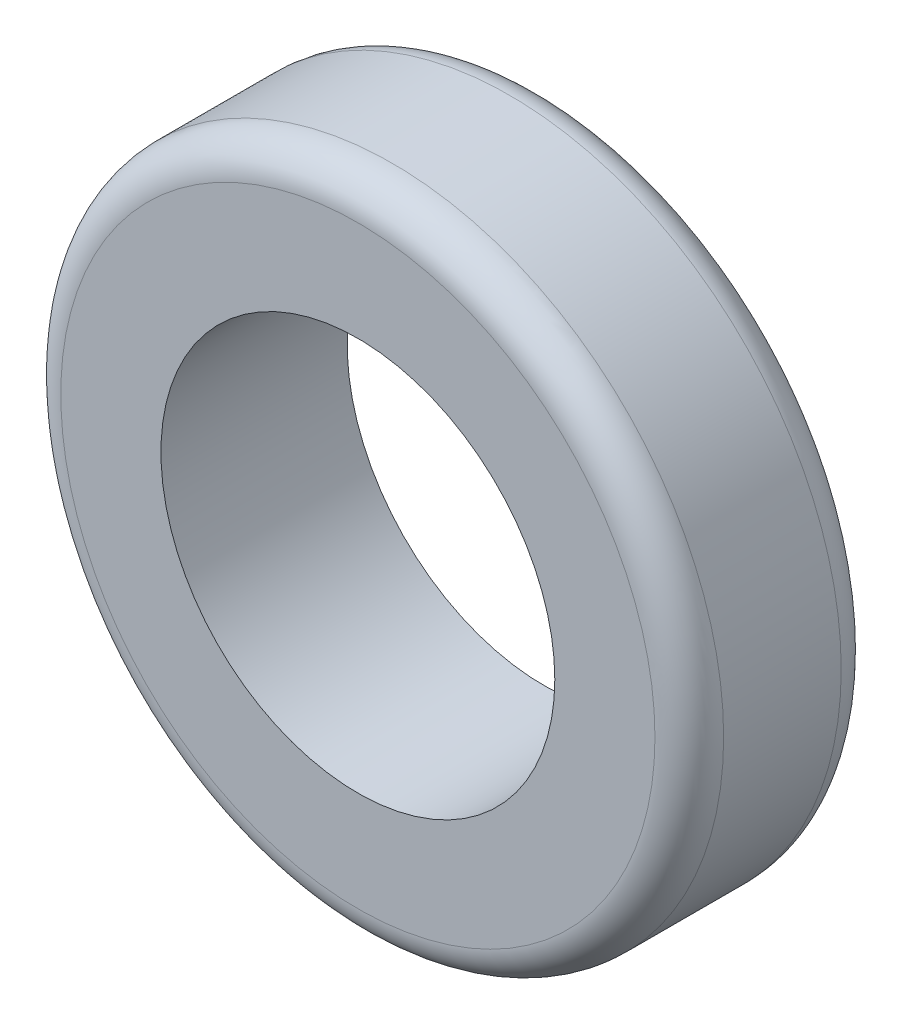
ISO-10303-21;
HEADER;
FILE_DESCRIPTION(('STEP AP214'),'2;1');
FILE_NAME('part.step','',(''),(''),'','','');
FILE_SCHEMA(('AUTOMOTIVE_DESIGN { 1 0 10303 214 1 1 1 1 }'));
ENDSEC;
DATA;
#1=APPLICATION_CONTEXT('core data for automotive mechanical design processes');
#2=APPLICATION_PROTOCOL_DEFINITION('international standard','automotive_design',2000,#1);
#3=PRODUCT_CONTEXT('',#1,'mechanical');
#4=PRODUCT('Part','Part','',(#3));
#5=PRODUCT_RELATED_PRODUCT_CATEGORY('part','',(#4));
#6=PRODUCT_DEFINITION_FORMATION('','',#4);
#7=PRODUCT_DEFINITION_CONTEXT('part definition',#1,'design');
#8=PRODUCT_DEFINITION('design','',#6,#7);
#9=PRODUCT_DEFINITION_SHAPE('','',#8);
#10=(LENGTH_UNIT() NAMED_UNIT(*) SI_UNIT(.MILLI.,.METRE.));
#11=(NAMED_UNIT(*) PLANE_ANGLE_UNIT() SI_UNIT($,.RADIAN.));
#12=(NAMED_UNIT(*) SI_UNIT($,.STERADIAN.) SOLID_ANGLE_UNIT());
#13=UNCERTAINTY_MEASURE_WITH_UNIT(LENGTH_MEASURE(1.E-05),#10,'distance_accuracy_value','');
#14=(GEOMETRIC_REPRESENTATION_CONTEXT(3) GLOBAL_UNCERTAINTY_ASSIGNED_CONTEXT((#13)) GLOBAL_UNIT_ASSIGNED_CONTEXT((#10,
#11,#12)) REPRESENTATION_CONTEXT('',''));
#15=CARTESIAN_POINT('',(0.,0.,0.));
#16=DIRECTION('',(0.,0.,1.));
#17=DIRECTION('',(1.,0.,0.));
#18=AXIS2_PLACEMENT_3D('',#15,#16,#17);
#19=CARTESIAN_POINT('',(58.7426052187726,48.9426246368741,54.23));
#20=DIRECTION('',(0.,0.,-1.));
#21=DIRECTION('',(-1.,0.,0.));
#22=AXIS2_PLACEMENT_3D('',#19,#20,#21);
#23=CYLINDRICAL_SURFACE('',#22,96.5);
#24=CARTESIAN_POINT('',(58.7426052187726,48.9426246368741,10.));
#25=DIRECTION('',(0.,0.,1.));
#26=DIRECTION('',(1.,0.,0.));
#27=AXIS2_PLACEMENT_3D('',#24,#25,#26);
#28=CIRCLE('',#27,96.5);
#29=CARTESIAN_POINT('',(155.242605218773,48.9426246368741,10.));
#30=VERTEX_POINT('',#29);
#31=EDGE_CURVE('E43',#30,#30,#28,.T.);
#32=ORIENTED_EDGE('',*,*,#31,.T.);
#33=EDGE_LOOP('',(#32));
#34=FACE_BOUND('',#33,.T.);
#35=CARTESIAN_POINT('',(58.7426052187726,48.9426246368741,44.23));
#36=DIRECTION('',(0.,0.,1.));
#37=DIRECTION('',(1.,0.,0.));
#38=AXIS2_PLACEMENT_3D('',#35,#36,#37);
#39=CIRCLE('',#38,96.5);
#40=CARTESIAN_POINT('',(155.242605218773,48.9426246368741,44.23));
#41=VERTEX_POINT('',#40);
#42=EDGE_CURVE('E47',#41,#41,#39,.F.);
#43=ORIENTED_EDGE('',*,*,#42,.T.);
#44=EDGE_LOOP('',(#43));
#45=FACE_BOUND('',#44,.T.);
#46=ADVANCED_FACE('F32',(#34,#45),#23,.T.);
#47=CARTESIAN_POINT('',(58.7426052187726,48.9426246368741,54.23));
#48=DIRECTION('',(0.,0.,1.));
#49=DIRECTION('',(1.,0.,0.));
#50=AXIS2_PLACEMENT_3D('',#47,#48,#49);
#51=PLANE('',#50);
#52=CARTESIAN_POINT('',(58.7426052187726,48.9426246368741,54.23));
#53=DIRECTION('',(0.,0.,1.));
#54=DIRECTION('',(1.,0.,0.));
#55=AXIS2_PLACEMENT_3D('',#52,#53,#54);
#56=CIRCLE('',#55,57.34);
#57=CARTESIAN_POINT('',(116.082605218773,48.9426246368741,54.23));
#58=VERTEX_POINT('',#57);
#59=EDGE_CURVE('E53',#58,#58,#56,.T.);
#60=ORIENTED_EDGE('',*,*,#59,.F.);
#61=EDGE_LOOP('',(#60));
#62=FACE_BOUND('',#61,.T.);
#63=CARTESIAN_POINT('',(58.7426052187726,48.9426246368741,54.23));
#64=DIRECTION('',(0.,0.,1.));
#65=DIRECTION('',(1.,0.,0.));
#66=AXIS2_PLACEMENT_3D('',#63,#64,#65);
#67=CIRCLE('',#66,86.5);
#68=CARTESIAN_POINT('',(145.242605218773,48.9426246368741,54.23));
#69=VERTEX_POINT('',#68);
#70=EDGE_CURVE('E10',#69,#69,#67,.T.);
#71=ORIENTED_EDGE('',*,*,#70,.T.);
#72=EDGE_LOOP('',(#71));
#73=FACE_BOUND('',#72,.T.);
#74=ADVANCED_FACE('F67',(#62,#73),#51,.T.);
#75=CARTESIAN_POINT('',(58.7426052187726,48.9426246368741,0.));
#76=DIRECTION('',(0.,0.,1.));
#77=DIRECTION('',(1.,0.,0.));
#78=AXIS2_PLACEMENT_3D('',#75,#76,#77);
#79=PLANE('',#78);
#80=CARTESIAN_POINT('',(58.7426052187726,48.9426246368741,0.));
#81=DIRECTION('',(0.,0.,1.));
#82=DIRECTION('',(1.,0.,0.));
#83=AXIS2_PLACEMENT_3D('',#80,#81,#82);
#84=CIRCLE('',#83,57.34);
#85=CARTESIAN_POINT('',(116.082605218773,48.9426246368741,0.));
#86=VERTEX_POINT('',#85);
#87=EDGE_CURVE('E52',#86,#86,#84,.T.);
#88=ORIENTED_EDGE('',*,*,#87,.T.);
#89=EDGE_LOOP('',(#88));
#90=FACE_BOUND('',#89,.T.);
#91=CARTESIAN_POINT('',(58.7426052187726,48.9426246368741,0.));
#92=DIRECTION('',(0.,0.,1.));
#93=DIRECTION('',(1.,0.,0.));
#94=AXIS2_PLACEMENT_3D('',#91,#92,#93);
#95=CIRCLE('',#94,86.5);
#96=CARTESIAN_POINT('',(145.242605218773,48.9426246368741,0.));
#97=VERTEX_POINT('',#96);
#98=EDGE_CURVE('E39',#97,#97,#95,.F.);
#99=ORIENTED_EDGE('',*,*,#98,.T.);
#100=EDGE_LOOP('',(#99));
#101=FACE_BOUND('',#100,.T.);
#102=ADVANCED_FACE('F59',(#90,#101),#79,.F.);
#103=CARTESIAN_POINT('',(58.7426052187726,48.9426246368741,10.));
#104=DIRECTION('',(0.,0.,1.));
#105=DIRECTION('',(1.,0.,0.));
#106=AXIS2_PLACEMENT_3D('',#103,#104,#105);
#107=TOROIDAL_SURFACE('',#106,86.5,10.);
#108=ORIENTED_EDGE('',*,*,#98,.F.);
#109=EDGE_LOOP('',(#108));
#110=FACE_BOUND('',#109,.T.);
#111=ORIENTED_EDGE('',*,*,#31,.F.);
#112=EDGE_LOOP('',(#111));
#113=FACE_BOUND('',#112,.T.);
#114=ADVANCED_FACE('F74',(#110,#113),#107,.T.);
#115=CARTESIAN_POINT('',(58.7426052187726,48.9426246368741,44.23));
#116=DIRECTION('',(0.,0.,1.));
#117=DIRECTION('',(1.,0.,0.));
#118=AXIS2_PLACEMENT_3D('',#115,#116,#117);
#119=TOROIDAL_SURFACE('',#118,86.5,10.);
#120=ORIENTED_EDGE('',*,*,#42,.F.);
#121=EDGE_LOOP('',(#120));
#122=FACE_BOUND('',#121,.T.);
#123=ORIENTED_EDGE('',*,*,#70,.F.);
#124=EDGE_LOOP('',(#123));
#125=FACE_BOUND('',#124,.T.);
#126=ADVANCED_FACE('F34',(#122,#125),#119,.T.);
#127=CARTESIAN_POINT('',(58.7426052187726,48.9426246368741,0.));
#128=DIRECTION('',(0.,0.,1.));
#129=DIRECTION('',(1.,0.,0.));
#130=AXIS2_PLACEMENT_3D('',#127,#128,#129);
#131=CYLINDRICAL_SURFACE('',#130,57.34);
#132=ORIENTED_EDGE('',*,*,#87,.F.);
#133=EDGE_LOOP('',(#132));
#134=FACE_BOUND('',#133,.T.);
#135=ORIENTED_EDGE('',*,*,#59,.T.);
#136=EDGE_LOOP('',(#135));
#137=FACE_BOUND('',#136,.T.);
#138=ADVANCED_FACE('F61',(#134,#137),#131,.F.);
#139=CLOSED_SHELL('',(#46,#74,#102,#114,#126,#138));
#140=MANIFOLD_SOLID_BREP('B2',#139);
#141=ADVANCED_BREP_SHAPE_REPRESENTATION('',(#18,#140),#14);
#142=SHAPE_DEFINITION_REPRESENTATION(#9,#141);
ENDSEC;
END-ISO-10303-21;
